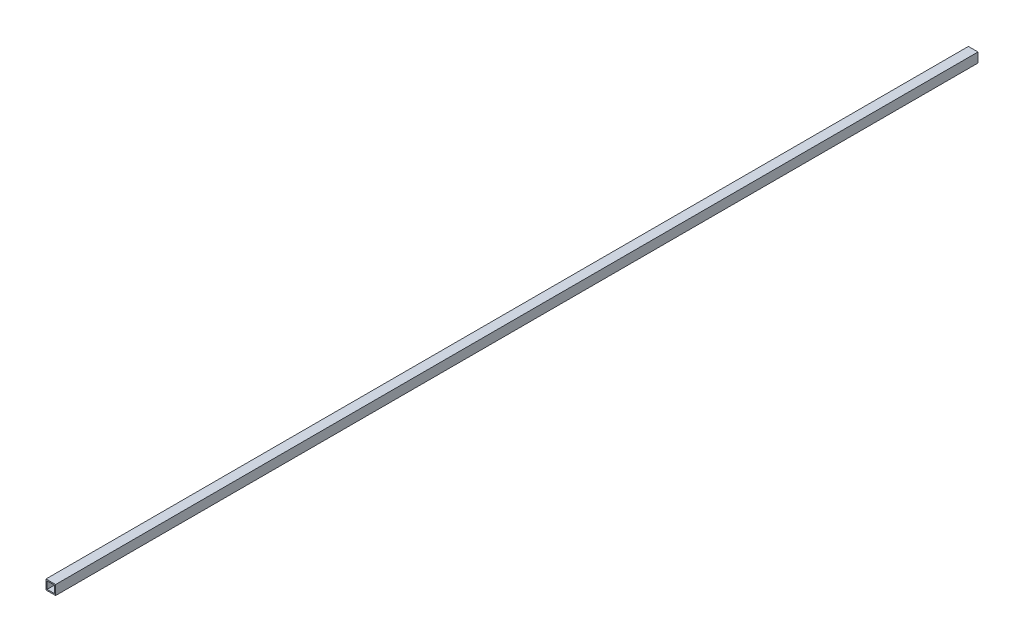
ISO-10303-21;
HEADER;
FILE_DESCRIPTION(('STEP AP214'),'2;1');
FILE_NAME('part.step','',(''),(''),'','','');
FILE_SCHEMA(('AUTOMOTIVE_DESIGN { 1 0 10303 214 1 1 1 1 }'));
ENDSEC;
DATA;
#1=APPLICATION_CONTEXT('core data for automotive mechanical design processes');
#2=APPLICATION_PROTOCOL_DEFINITION('international standard','automotive_design',2000,#1);
#3=PRODUCT_CONTEXT('',#1,'mechanical');
#4=PRODUCT('Part','Part','',(#3));
#5=PRODUCT_RELATED_PRODUCT_CATEGORY('part','',(#4));
#6=PRODUCT_DEFINITION_FORMATION('','',#4);
#7=PRODUCT_DEFINITION_CONTEXT('part definition',#1,'design');
#8=PRODUCT_DEFINITION('design','',#6,#7);
#9=PRODUCT_DEFINITION_SHAPE('','',#8);
#10=(LENGTH_UNIT() NAMED_UNIT(*) SI_UNIT(.MILLI.,.METRE.));
#11=(NAMED_UNIT(*) PLANE_ANGLE_UNIT() SI_UNIT($,.RADIAN.));
#12=(NAMED_UNIT(*) SI_UNIT($,.STERADIAN.) SOLID_ANGLE_UNIT());
#13=UNCERTAINTY_MEASURE_WITH_UNIT(LENGTH_MEASURE(1.E-05),#10,'distance_accuracy_value','');
#14=(GEOMETRIC_REPRESENTATION_CONTEXT(3) GLOBAL_UNCERTAINTY_ASSIGNED_CONTEXT((#13)) GLOBAL_UNIT_ASSIGNED_CONTEXT((#10,
#11,#12)) REPRESENTATION_CONTEXT('',''));
#15=CARTESIAN_POINT('',(0.,0.,0.));
#16=DIRECTION('',(0.,0.,1.));
#17=DIRECTION('',(1.,0.,0.));
#18=AXIS2_PLACEMENT_3D('',#15,#16,#17);
#19=CARTESIAN_POINT('',(0.,0.,2438.4));
#20=DIRECTION('',(0.,0.,-1.));
#21=DIRECTION('',(-1.,0.,0.));
#22=AXIS2_PLACEMENT_3D('',#19,#20,#21);
#23=PLANE('',#22);
#24=DIRECTION('',(0.,-1.,0.));
#25=VECTOR('',#24,1.);
#26=CARTESIAN_POINT('',(0.,0.,2438.4));
#27=LINE('',#26,#25);
#28=CARTESIAN_POINT('',(0.,25.4,2438.4));
#29=VERTEX_POINT('',#28);
#30=CARTESIAN_POINT('',(0.,0.,2438.4));
#31=VERTEX_POINT('',#30);
#32=EDGE_CURVE('E135',#29,#31,#27,.T.);
#33=ORIENTED_EDGE('',*,*,#32,.T.);
#34=DIRECTION('',(1.,0.,0.));
#35=VECTOR('',#34,1.);
#36=CARTESIAN_POINT('',(0.,0.,2438.4));
#37=LINE('',#36,#35);
#38=CARTESIAN_POINT('',(25.4,0.,2438.4));
#39=VERTEX_POINT('',#38);
#40=EDGE_CURVE('E138',#31,#39,#37,.T.);
#41=ORIENTED_EDGE('',*,*,#40,.T.);
#42=DIRECTION('',(0.,1.,0.));
#43=VECTOR('',#42,1.);
#44=CARTESIAN_POINT('',(25.4,0.,2438.4));
#45=LINE('',#44,#43);
#46=CARTESIAN_POINT('',(25.4,25.4,2438.4));
#47=VERTEX_POINT('',#46);
#48=EDGE_CURVE('E141',#39,#47,#45,.T.);
#49=ORIENTED_EDGE('',*,*,#48,.T.);
#50=DIRECTION('',(-1.,0.,0.));
#51=VECTOR('',#50,1.);
#52=CARTESIAN_POINT('',(0.,25.4,2438.4));
#53=LINE('',#52,#51);
#54=EDGE_CURVE('E143',#47,#29,#53,.T.);
#55=ORIENTED_EDGE('',*,*,#54,.T.);
#56=EDGE_LOOP('',(#33,#41,#49,#55));
#57=FACE_BOUND('',#56,.T.);
#58=DIRECTION('',(0.,-1.,0.));
#59=VECTOR('',#58,1.);
#60=CARTESIAN_POINT('',(3.03784,3.03784,2438.4));
#61=LINE('',#60,#59);
#62=CARTESIAN_POINT('',(3.03784,22.36216,2438.4));
#63=VERTEX_POINT('',#62);
#64=CARTESIAN_POINT('',(3.03784,3.03784,2438.4));
#65=VERTEX_POINT('',#64);
#66=EDGE_CURVE('E99',#63,#65,#61,.T.);
#67=ORIENTED_EDGE('',*,*,#66,.F.);
#68=DIRECTION('',(-1.,0.,0.));
#69=VECTOR('',#68,1.);
#70=CARTESIAN_POINT('',(3.03784,22.36216,2438.4));
#71=LINE('',#70,#69);
#72=CARTESIAN_POINT('',(22.36216,22.36216,2438.4));
#73=VERTEX_POINT('',#72);
#74=EDGE_CURVE('E121',#73,#63,#71,.T.);
#75=ORIENTED_EDGE('',*,*,#74,.F.);
#76=DIRECTION('',(0.,1.,0.));
#77=VECTOR('',#76,1.);
#78=CARTESIAN_POINT('',(22.36216,3.03784,2438.4));
#79=LINE('',#78,#77);
#80=CARTESIAN_POINT('',(22.36216,3.03784,2438.4));
#81=VERTEX_POINT('',#80);
#82=EDGE_CURVE('E119',#81,#73,#79,.T.);
#83=ORIENTED_EDGE('',*,*,#82,.F.);
#84=DIRECTION('',(1.,0.,0.));
#85=VECTOR('',#84,1.);
#86=CARTESIAN_POINT('',(3.03784,3.03784,2438.4));
#87=LINE('',#86,#85);
#88=EDGE_CURVE('E107',#65,#81,#87,.T.);
#89=ORIENTED_EDGE('',*,*,#88,.F.);
#90=EDGE_LOOP('',(#67,#75,#83,#89));
#91=FACE_BOUND('',#90,.T.);
#92=ADVANCED_FACE('F34',(#57,#91),#23,.F.);
#93=CARTESIAN_POINT('',(0.,0.,0.));
#94=DIRECTION('',(0.,0.,-1.));
#95=DIRECTION('',(-1.,0.,0.));
#96=AXIS2_PLACEMENT_3D('',#93,#94,#95);
#97=PLANE('',#96);
#98=DIRECTION('',(0.,-1.,0.));
#99=VECTOR('',#98,1.);
#100=CARTESIAN_POINT('',(0.,0.,0.));
#101=LINE('',#100,#99);
#102=CARTESIAN_POINT('',(0.,25.4,0.));
#103=VERTEX_POINT('',#102);
#104=CARTESIAN_POINT('',(0.,0.,0.));
#105=VERTEX_POINT('',#104);
#106=EDGE_CURVE('E115',#103,#105,#101,.T.);
#107=ORIENTED_EDGE('',*,*,#106,.F.);
#108=DIRECTION('',(-1.,0.,0.));
#109=VECTOR('',#108,1.);
#110=CARTESIAN_POINT('',(0.,25.4,0.));
#111=LINE('',#110,#109);
#112=CARTESIAN_POINT('',(25.4,25.4,0.));
#113=VERTEX_POINT('',#112);
#114=EDGE_CURVE('E139',#113,#103,#111,.T.);
#115=ORIENTED_EDGE('',*,*,#114,.F.);
#116=DIRECTION('',(0.,1.,0.));
#117=VECTOR('',#116,1.);
#118=CARTESIAN_POINT('',(25.4,0.,0.));
#119=LINE('',#118,#117);
#120=CARTESIAN_POINT('',(25.4,0.,0.));
#121=VERTEX_POINT('',#120);
#122=EDGE_CURVE('E150',#121,#113,#119,.T.);
#123=ORIENTED_EDGE('',*,*,#122,.F.);
#124=DIRECTION('',(1.,0.,0.));
#125=VECTOR('',#124,1.);
#126=CARTESIAN_POINT('',(0.,0.,0.));
#127=LINE('',#126,#125);
#128=EDGE_CURVE('E148',#105,#121,#127,.T.);
#129=ORIENTED_EDGE('',*,*,#128,.F.);
#130=EDGE_LOOP('',(#107,#115,#123,#129));
#131=FACE_BOUND('',#130,.T.);
#132=DIRECTION('',(-1.,0.,0.));
#133=VECTOR('',#132,1.);
#134=CARTESIAN_POINT('',(3.03784,22.36216,0.));
#135=LINE('',#134,#133);
#136=CARTESIAN_POINT('',(22.36216,22.36216,0.));
#137=VERTEX_POINT('',#136);
#138=CARTESIAN_POINT('',(3.03784,22.36216,0.));
#139=VERTEX_POINT('',#138);
#140=EDGE_CURVE('E108',#137,#139,#135,.T.);
#141=ORIENTED_EDGE('',*,*,#140,.T.);
#142=DIRECTION('',(0.,-1.,0.));
#143=VECTOR('',#142,1.);
#144=CARTESIAN_POINT('',(3.03784,3.03784,0.));
#145=LINE('',#144,#143);
#146=CARTESIAN_POINT('',(3.03784,3.03784,0.));
#147=VERTEX_POINT('',#146);
#148=EDGE_CURVE('E57',#139,#147,#145,.T.);
#149=ORIENTED_EDGE('',*,*,#148,.T.);
#150=DIRECTION('',(1.,0.,0.));
#151=VECTOR('',#150,1.);
#152=CARTESIAN_POINT('',(3.03784,3.03784,0.));
#153=LINE('',#152,#151);
#154=CARTESIAN_POINT('',(22.36216,3.03784,0.));
#155=VERTEX_POINT('',#154);
#156=EDGE_CURVE('E114',#147,#155,#153,.T.);
#157=ORIENTED_EDGE('',*,*,#156,.T.);
#158=DIRECTION('',(0.,1.,0.));
#159=VECTOR('',#158,1.);
#160=CARTESIAN_POINT('',(22.36216,3.03784,0.));
#161=LINE('',#160,#159);
#162=EDGE_CURVE('E127',#155,#137,#161,.T.);
#163=ORIENTED_EDGE('',*,*,#162,.T.);
#164=EDGE_LOOP('',(#141,#149,#157,#163));
#165=FACE_BOUND('',#164,.T.);
#166=ADVANCED_FACE('F168',(#131,#165),#97,.T.);
#167=CARTESIAN_POINT('',(0.,0.,2438.4));
#168=DIRECTION('',(1.,0.,0.));
#169=DIRECTION('',(0.,0.,-1.));
#170=AXIS2_PLACEMENT_3D('',#167,#168,#169);
#171=PLANE('',#170);
#172=ORIENTED_EDGE('',*,*,#106,.T.);
#173=DIRECTION('',(0.,0.,-1.));
#174=VECTOR('',#173,1.);
#175=CARTESIAN_POINT('',(0.,0.,2438.4));
#176=LINE('',#175,#174);
#177=EDGE_CURVE('E11',#31,#105,#176,.T.);
#178=ORIENTED_EDGE('',*,*,#177,.F.);
#179=ORIENTED_EDGE('',*,*,#32,.F.);
#180=DIRECTION('',(0.,0.,-1.));
#181=VECTOR('',#180,1.);
#182=CARTESIAN_POINT('',(0.,25.4,2438.4));
#183=LINE('',#182,#181);
#184=EDGE_CURVE('E145',#29,#103,#183,.T.);
#185=ORIENTED_EDGE('',*,*,#184,.T.);
#186=EDGE_LOOP('',(#172,#178,#179,#185));
#187=FACE_BOUND('',#186,.T.);
#188=ADVANCED_FACE('F36',(#187),#171,.F.);
#189=CARTESIAN_POINT('',(0.,0.,2438.4));
#190=DIRECTION('',(0.,1.,0.));
#191=DIRECTION('',(0.,0.,1.));
#192=AXIS2_PLACEMENT_3D('',#189,#190,#191);
#193=PLANE('',#192);
#194=ORIENTED_EDGE('',*,*,#128,.T.);
#195=DIRECTION('',(0.,0.,-1.));
#196=VECTOR('',#195,1.);
#197=CARTESIAN_POINT('',(25.4,0.,2438.4));
#198=LINE('',#197,#196);
#199=EDGE_CURVE('E42',#39,#121,#198,.T.);
#200=ORIENTED_EDGE('',*,*,#199,.F.);
#201=ORIENTED_EDGE('',*,*,#40,.F.);
#202=ORIENTED_EDGE('',*,*,#177,.T.);
#203=EDGE_LOOP('',(#194,#200,#201,#202));
#204=FACE_BOUND('',#203,.T.);
#205=ADVANCED_FACE('F178',(#204),#193,.F.);
#206=CARTESIAN_POINT('',(25.4,0.,2438.4));
#207=DIRECTION('',(-1.,0.,0.));
#208=DIRECTION('',(0.,0.,1.));
#209=AXIS2_PLACEMENT_3D('',#206,#207,#208);
#210=PLANE('',#209);
#211=ORIENTED_EDGE('',*,*,#122,.T.);
#212=DIRECTION('',(0.,0.,-1.));
#213=VECTOR('',#212,1.);
#214=CARTESIAN_POINT('',(25.4,25.4,2438.4));
#215=LINE('',#214,#213);
#216=EDGE_CURVE('E155',#47,#113,#215,.T.);
#217=ORIENTED_EDGE('',*,*,#216,.F.);
#218=ORIENTED_EDGE('',*,*,#48,.F.);
#219=ORIENTED_EDGE('',*,*,#199,.T.);
#220=EDGE_LOOP('',(#211,#217,#218,#219));
#221=FACE_BOUND('',#220,.T.);
#222=ADVANCED_FACE('F162',(#221),#210,.F.);
#223=CARTESIAN_POINT('',(0.,25.4,2438.4));
#224=DIRECTION('',(0.,-1.,0.));
#225=DIRECTION('',(0.,0.,-1.));
#226=AXIS2_PLACEMENT_3D('',#223,#224,#225);
#227=PLANE('',#226);
#228=ORIENTED_EDGE('',*,*,#114,.T.);
#229=ORIENTED_EDGE('',*,*,#184,.F.);
#230=ORIENTED_EDGE('',*,*,#54,.F.);
#231=ORIENTED_EDGE('',*,*,#216,.T.);
#232=EDGE_LOOP('',(#228,#229,#230,#231));
#233=FACE_BOUND('',#232,.T.);
#234=ADVANCED_FACE('F172',(#233),#227,.F.);
#235=CARTESIAN_POINT('',(3.03784,3.03784,2438.4));
#236=DIRECTION('',(1.,0.,0.));
#237=DIRECTION('',(0.,1.,0.));
#238=AXIS2_PLACEMENT_3D('',#235,#236,#237);
#239=PLANE('',#238);
#240=ORIENTED_EDGE('',*,*,#148,.F.);
#241=DIRECTION('',(0.,0.,-1.));
#242=VECTOR('',#241,1.);
#243=CARTESIAN_POINT('',(3.03784,22.36216,2438.4));
#244=LINE('',#243,#242);
#245=EDGE_CURVE('E103',#63,#139,#244,.T.);
#246=ORIENTED_EDGE('',*,*,#245,.F.);
#247=ORIENTED_EDGE('',*,*,#66,.T.);
#248=DIRECTION('',(0.,0.,-1.));
#249=VECTOR('',#248,1.);
#250=CARTESIAN_POINT('',(3.03784,3.03784,2438.4));
#251=LINE('',#250,#249);
#252=EDGE_CURVE('E102',#65,#147,#251,.T.);
#253=ORIENTED_EDGE('',*,*,#252,.T.);
#254=EDGE_LOOP('',(#240,#246,#247,#253));
#255=FACE_BOUND('',#254,.T.);
#256=ADVANCED_FACE('F101',(#255),#239,.T.);
#257=CARTESIAN_POINT('',(3.03784,3.03784,2438.4));
#258=DIRECTION('',(0.,1.,0.));
#259=DIRECTION('',(-1.,0.,0.));
#260=AXIS2_PLACEMENT_3D('',#257,#258,#259);
#261=PLANE('',#260);
#262=ORIENTED_EDGE('',*,*,#156,.F.);
#263=ORIENTED_EDGE('',*,*,#252,.F.);
#264=ORIENTED_EDGE('',*,*,#88,.T.);
#265=DIRECTION('',(0.,0.,-1.));
#266=VECTOR('',#265,1.);
#267=CARTESIAN_POINT('',(22.36216,3.03784,2438.4));
#268=LINE('',#267,#266);
#269=EDGE_CURVE('E116',#81,#155,#268,.T.);
#270=ORIENTED_EDGE('',*,*,#269,.T.);
#271=EDGE_LOOP('',(#262,#263,#264,#270));
#272=FACE_BOUND('',#271,.T.);
#273=ADVANCED_FACE('F111',(#272),#261,.T.);
#274=CARTESIAN_POINT('',(22.36216,3.03784,2438.4));
#275=DIRECTION('',(-1.,0.,0.));
#276=DIRECTION('',(0.,-1.,0.));
#277=AXIS2_PLACEMENT_3D('',#274,#275,#276);
#278=PLANE('',#277);
#279=ORIENTED_EDGE('',*,*,#162,.F.);
#280=ORIENTED_EDGE('',*,*,#269,.F.);
#281=ORIENTED_EDGE('',*,*,#82,.T.);
#282=DIRECTION('',(0.,0.,-1.));
#283=VECTOR('',#282,1.);
#284=CARTESIAN_POINT('',(22.36216,22.36216,2438.4));
#285=LINE('',#284,#283);
#286=EDGE_CURVE('E49',#73,#137,#285,.T.);
#287=ORIENTED_EDGE('',*,*,#286,.T.);
#288=EDGE_LOOP('',(#279,#280,#281,#287));
#289=FACE_BOUND('',#288,.T.);
#290=ADVANCED_FACE('F201',(#289),#278,.T.);
#291=CARTESIAN_POINT('',(3.03784,22.36216,2438.4));
#292=DIRECTION('',(0.,-1.,0.));
#293=DIRECTION('',(1.,0.,0.));
#294=AXIS2_PLACEMENT_3D('',#291,#292,#293);
#295=PLANE('',#294);
#296=ORIENTED_EDGE('',*,*,#140,.F.);
#297=ORIENTED_EDGE('',*,*,#286,.F.);
#298=ORIENTED_EDGE('',*,*,#74,.T.);
#299=ORIENTED_EDGE('',*,*,#245,.T.);
#300=EDGE_LOOP('',(#296,#297,#298,#299));
#301=FACE_BOUND('',#300,.T.);
#302=ADVANCED_FACE('F205',(#301),#295,.T.);
#303=CLOSED_SHELL('',(#92,#166,#188,#205,#222,#234,#256,#273,#290,#302));
#304=MANIFOLD_SOLID_BREP('B2',#303);
#305=ADVANCED_BREP_SHAPE_REPRESENTATION('',(#18,#304),#14);
#306=SHAPE_DEFINITION_REPRESENTATION(#9,#305);
ENDSEC;
END-ISO-10303-21;
